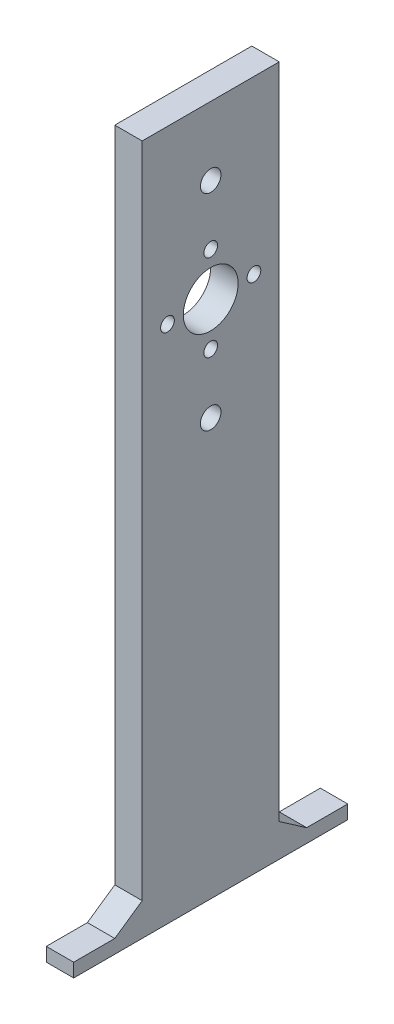
ISO-10303-21;
HEADER;
FILE_DESCRIPTION(('STEP AP214'),'2;1');
FILE_NAME('part.step','',(''),(''),'','','');
FILE_SCHEMA(('AUTOMOTIVE_DESIGN { 1 0 10303 214 1 1 1 1 }'));
ENDSEC;
DATA;
#1=APPLICATION_CONTEXT('core data for automotive mechanical design processes');
#2=APPLICATION_PROTOCOL_DEFINITION('international standard','automotive_design',2000,#1);
#3=PRODUCT_CONTEXT('',#1,'mechanical');
#4=PRODUCT('Part','Part','',(#3));
#5=PRODUCT_RELATED_PRODUCT_CATEGORY('part','',(#4));
#6=PRODUCT_DEFINITION_FORMATION('','',#4);
#7=PRODUCT_DEFINITION_CONTEXT('part definition',#1,'design');
#8=PRODUCT_DEFINITION('design','',#6,#7);
#9=PRODUCT_DEFINITION_SHAPE('','',#8);
#10=(LENGTH_UNIT() NAMED_UNIT(*) SI_UNIT(.MILLI.,.METRE.));
#11=(NAMED_UNIT(*) PLANE_ANGLE_UNIT() SI_UNIT($,.RADIAN.));
#12=(NAMED_UNIT(*) SI_UNIT($,.STERADIAN.) SOLID_ANGLE_UNIT());
#13=UNCERTAINTY_MEASURE_WITH_UNIT(LENGTH_MEASURE(1.E-05),#10,'distance_accuracy_value','');
#14=(GEOMETRIC_REPRESENTATION_CONTEXT(3) GLOBAL_UNCERTAINTY_ASSIGNED_CONTEXT((#13)) GLOBAL_UNIT_ASSIGNED_CONTEXT((#10,
#11,#12)) REPRESENTATION_CONTEXT('',''));
#15=CARTESIAN_POINT('',(0.,0.,0.));
#16=DIRECTION('',(0.,0.,1.));
#17=DIRECTION('',(1.,0.,0.));
#18=AXIS2_PLACEMENT_3D('',#15,#16,#17);
#19=CARTESIAN_POINT('',(0.,252.,25.));
#20=DIRECTION('',(0.,0.,-1.));
#21=DIRECTION('',(-1.,0.,0.));
#22=AXIS2_PLACEMENT_3D('',#19,#20,#21);
#23=PLANE('',#22);
#24=DIRECTION('',(0.,-1.,0.));
#25=VECTOR('',#24,1.);
#26=CARTESIAN_POINT('',(10.,252.,25.));
#27=LINE('',#26,#25);
#28=CARTESIAN_POINT('',(10.,5.,25.));
#29=VERTEX_POINT('',#28);
#30=CARTESIAN_POINT('',(10.,0.,25.));
#31=VERTEX_POINT('',#30);
#32=EDGE_CURVE('E49',#29,#31,#27,.T.);
#33=ORIENTED_EDGE('',*,*,#32,.F.);
#34=DIRECTION('',(-1.,0.,0.));
#35=VECTOR('',#34,1.);
#36=CARTESIAN_POINT('',(10.,5.,25.));
#37=LINE('',#36,#35);
#38=CARTESIAN_POINT('',(0.,5.,25.));
#39=VERTEX_POINT('',#38);
#40=EDGE_CURVE('E156',#29,#39,#37,.T.);
#41=ORIENTED_EDGE('',*,*,#40,.T.);
#42=DIRECTION('',(0.,-1.,0.));
#43=VECTOR('',#42,1.);
#44=CARTESIAN_POINT('',(0.,252.,25.));
#45=LINE('',#44,#43);
#46=CARTESIAN_POINT('',(0.,0.,25.));
#47=VERTEX_POINT('',#46);
#48=EDGE_CURVE('E11',#39,#47,#45,.T.);
#49=ORIENTED_EDGE('',*,*,#48,.T.);
#50=DIRECTION('',(1.,0.,0.));
#51=VECTOR('',#50,1.);
#52=CARTESIAN_POINT('',(0.,0.,25.));
#53=LINE('',#52,#51);
#54=EDGE_CURVE('E152',#47,#31,#53,.T.);
#55=ORIENTED_EDGE('',*,*,#54,.T.);
#56=EDGE_LOOP('',(#33,#41,#49,#55));
#57=FACE_BOUND('',#56,.T.);
#58=ADVANCED_FACE('F42',(#57),#23,.F.);
#59=CARTESIAN_POINT('',(10.,252.,-75.));
#60=DIRECTION('',(-1.,0.,0.));
#61=DIRECTION('',(0.,0.,1.));
#62=AXIS2_PLACEMENT_3D('',#59,#60,#61);
#63=PLANE('',#62);
#64=CARTESIAN_POINT('',(10.,189.5,-40.7700000000017));
#65=DIRECTION('',(-1.,0.,0.));
#66=DIRECTION('',(0.,0.,1.));
#67=AXIS2_PLACEMENT_3D('',#64,#65,#66);
#68=CIRCLE('',#67,2.5);
#69=CARTESIAN_POINT('',(10.,189.5,-38.2700000000017));
#70=VERTEX_POINT('',#69);
#71=EDGE_CURVE('E226',#70,#70,#68,.T.);
#72=ORIENTED_EDGE('',*,*,#71,.T.);
#73=EDGE_LOOP('',(#72));
#74=FACE_BOUND('',#73,.T.);
#75=CARTESIAN_POINT('',(10.,189.5,-9.23000000000167));
#76=DIRECTION('',(-1.,0.,0.));
#77=DIRECTION('',(0.,0.,-1.));
#78=AXIS2_PLACEMENT_3D('',#75,#76,#77);
#79=CIRCLE('',#78,2.5);
#80=CARTESIAN_POINT('',(10.,189.5,-11.7300000000017));
#81=VERTEX_POINT('',#80);
#82=EDGE_CURVE('E246',#81,#81,#79,.T.);
#83=ORIENTED_EDGE('',*,*,#82,.T.);
#84=EDGE_LOOP('',(#83));
#85=FACE_BOUND('',#84,.T.);
#86=CARTESIAN_POINT('',(10.,205.27,-25.0000000000017));
#87=DIRECTION('',(-1.,0.,0.));
#88=DIRECTION('',(0.,0.,1.));
#89=AXIS2_PLACEMENT_3D('',#86,#87,#88);
#90=CIRCLE('',#89,2.5);
#91=CARTESIAN_POINT('',(10.,205.27,-22.5000000000017));
#92=VERTEX_POINT('',#91);
#93=EDGE_CURVE('E240',#92,#92,#90,.T.);
#94=ORIENTED_EDGE('',*,*,#93,.T.);
#95=EDGE_LOOP('',(#94));
#96=FACE_BOUND('',#95,.T.);
#97=CARTESIAN_POINT('',(10.,173.73,-25.0000000000017));
#98=DIRECTION('',(-1.,0.,0.));
#99=DIRECTION('',(0.,0.,-1.));
#100=AXIS2_PLACEMENT_3D('',#97,#98,#99);
#101=CIRCLE('',#100,2.5);
#102=CARTESIAN_POINT('',(10.,173.73,-27.5000000000017));
#103=VERTEX_POINT('',#102);
#104=EDGE_CURVE('E234',#103,#103,#101,.T.);
#105=ORIENTED_EDGE('',*,*,#104,.T.);
#106=EDGE_LOOP('',(#105));
#107=FACE_BOUND('',#106,.T.);
#108=CARTESIAN_POINT('',(10.,152.,-25.0000000000017));
#109=DIRECTION('',(1.,0.,0.));
#110=DIRECTION('',(0.,0.,1.));
#111=AXIS2_PLACEMENT_3D('',#108,#109,#110);
#112=CIRCLE('',#111,3.75);
#113=CARTESIAN_POINT('',(10.,152.,-21.2500000000017));
#114=VERTEX_POINT('',#113);
#115=EDGE_CURVE('E225',#114,#114,#112,.T.);
#116=ORIENTED_EDGE('',*,*,#115,.F.);
#117=EDGE_LOOP('',(#116));
#118=FACE_BOUND('',#117,.T.);
#119=CARTESIAN_POINT('',(10.,227.,-25.0000000000017));
#120=DIRECTION('',(1.,0.,0.));
#121=DIRECTION('',(0.,0.,-1.));
#122=AXIS2_PLACEMENT_3D('',#119,#120,#121);
#123=CIRCLE('',#122,3.75);
#124=CARTESIAN_POINT('',(10.,227.,-28.7500000000017));
#125=VERTEX_POINT('',#124);
#126=EDGE_CURVE('E219',#125,#125,#123,.T.);
#127=ORIENTED_EDGE('',*,*,#126,.F.);
#128=EDGE_LOOP('',(#127));
#129=FACE_BOUND('',#128,.T.);
#130=CARTESIAN_POINT('',(10.,189.5,-25.0000000000017));
#131=DIRECTION('',(1.,0.,0.));
#132=DIRECTION('',(0.,0.,-1.));
#133=AXIS2_PLACEMENT_3D('',#130,#131,#132);
#134=CIRCLE('',#133,10.);
#135=CARTESIAN_POINT('',(10.,189.5,-35.0000000000017));
#136=VERTEX_POINT('',#135);
#137=EDGE_CURVE('E216',#136,#136,#134,.T.);
#138=ORIENTED_EDGE('',*,*,#137,.F.);
#139=EDGE_LOOP('',(#138));
#140=FACE_BOUND('',#139,.T.);
#141=DIRECTION('',(0.,0.,-1.));
#142=VECTOR('',#141,1.);
#143=CARTESIAN_POINT('',(10.,252.,25.));
#144=LINE('',#143,#142);
#145=CARTESIAN_POINT('',(10.,252.,0.));
#146=VERTEX_POINT('',#145);
#147=CARTESIAN_POINT('',(10.,252.,-50.0000000000034));
#148=VERTEX_POINT('',#147);
#149=EDGE_CURVE('E142',#146,#148,#144,.T.);
#150=ORIENTED_EDGE('',*,*,#149,.F.);
#151=DIRECTION('',(0.,-1.,0.));
#152=VECTOR('',#151,1.);
#153=CARTESIAN_POINT('',(10.,11.9378215415848,3.34454686168328E-12));
#154=LINE('',#153,#152);
#155=CARTESIAN_POINT('',(10.,11.9378215415848,3.34454686168328E-12));
#156=VERTEX_POINT('',#155);
#157=EDGE_CURVE('E135',#146,#156,#154,.T.);
#158=ORIENTED_EDGE('',*,*,#157,.T.);
#159=DIRECTION('',(0.,-0.570028639683379,0.821624823104023));
#160=VECTOR('',#159,1.);
#161=CARTESIAN_POINT('',(10.,5.,9.99999999999999));
#162=LINE('',#161,#160);
#163=CARTESIAN_POINT('',(10.,5.,9.99999999999999));
#164=VERTEX_POINT('',#163);
#165=EDGE_CURVE('E213',#156,#164,#162,.T.);
#166=ORIENTED_EDGE('',*,*,#165,.T.);
#167=DIRECTION('',(0.,0.,1.));
#168=VECTOR('',#167,1.);
#169=CARTESIAN_POINT('',(10.,5.,25.));
#170=LINE('',#169,#168);
#171=EDGE_CURVE('E172',#164,#29,#170,.T.);
#172=ORIENTED_EDGE('',*,*,#171,.T.);
#173=ORIENTED_EDGE('',*,*,#32,.T.);
#174=DIRECTION('',(0.,0.,-1.));
#175=VECTOR('',#174,1.);
#176=CARTESIAN_POINT('',(10.,0.,-75.));
#177=LINE('',#176,#175);
#178=CARTESIAN_POINT('',(10.,0.,-75.));
#179=VERTEX_POINT('',#178);
#180=EDGE_CURVE('E155',#31,#179,#177,.T.);
#181=ORIENTED_EDGE('',*,*,#180,.T.);
#182=DIRECTION('',(0.,-1.,0.));
#183=VECTOR('',#182,1.);
#184=CARTESIAN_POINT('',(10.,252.,-75.));
#185=LINE('',#184,#183);
#186=CARTESIAN_POINT('',(10.,5.,-75.));
#187=VERTEX_POINT('',#186);
#188=EDGE_CURVE('E162',#187,#179,#185,.T.);
#189=ORIENTED_EDGE('',*,*,#188,.F.);
#190=DIRECTION('',(0.,0.,1.));
#191=VECTOR('',#190,1.);
#192=CARTESIAN_POINT('',(10.,5.,-75.));
#193=LINE('',#192,#191);
#194=CARTESIAN_POINT('',(10.,5.,-60.));
#195=VERTEX_POINT('',#194);
#196=EDGE_CURVE('E149',#187,#195,#193,.T.);
#197=ORIENTED_EDGE('',*,*,#196,.T.);
#198=DIRECTION('',(0.,0.570028639683379,0.821624823104023));
#199=VECTOR('',#198,1.);
#200=CARTESIAN_POINT('',(10.,5.,-60.));
#201=LINE('',#200,#199);
#202=CARTESIAN_POINT('',(10.,11.9378215415848,-50.0000000000034));
#203=VERTEX_POINT('',#202);
#204=EDGE_CURVE('E187',#195,#203,#201,.T.);
#205=ORIENTED_EDGE('',*,*,#204,.T.);
#206=DIRECTION('',(0.,1.,0.));
#207=VECTOR('',#206,1.);
#208=CARTESIAN_POINT('',(10.,11.9378215415848,-50.0000000000034));
#209=LINE('',#208,#207);
#210=EDGE_CURVE('E191',#203,#148,#209,.T.);
#211=ORIENTED_EDGE('',*,*,#210,.T.);
#212=EDGE_LOOP('',(#150,#158,#166,#172,#173,#181,#189,#197,#205,#211));
#213=FACE_BOUND('',#212,.T.);
#214=ADVANCED_FACE('F167',(#74,#85,#96,#107,#118,#129,#140,#213),#63,.F.);
#215=CARTESIAN_POINT('',(0.,252.,-75.));
#216=DIRECTION('',(0.,0.,1.));
#217=DIRECTION('',(1.,0.,0.));
#218=AXIS2_PLACEMENT_3D('',#215,#216,#217);
#219=PLANE('',#218);
#220=DIRECTION('',(0.,-1.,0.));
#221=VECTOR('',#220,1.);
#222=CARTESIAN_POINT('',(0.,252.,-75.));
#223=LINE('',#222,#221);
#224=CARTESIAN_POINT('',(0.,5.,-75.));
#225=VERTEX_POINT('',#224);
#226=CARTESIAN_POINT('',(0.,0.,-75.));
#227=VERTEX_POINT('',#226);
#228=EDGE_CURVE('E64',#225,#227,#223,.T.);
#229=ORIENTED_EDGE('',*,*,#228,.F.);
#230=DIRECTION('',(-1.,0.,0.));
#231=VECTOR('',#230,1.);
#232=CARTESIAN_POINT('',(10.,5.,-75.));
#233=LINE('',#232,#231);
#234=EDGE_CURVE('E182',#187,#225,#233,.T.);
#235=ORIENTED_EDGE('',*,*,#234,.F.);
#236=ORIENTED_EDGE('',*,*,#188,.T.);
#237=DIRECTION('',(-1.,0.,0.));
#238=VECTOR('',#237,1.);
#239=CARTESIAN_POINT('',(0.,0.,-75.));
#240=LINE('',#239,#238);
#241=EDGE_CURVE('E146',#179,#227,#240,.T.);
#242=ORIENTED_EDGE('',*,*,#241,.T.);
#243=EDGE_LOOP('',(#229,#235,#236,#242));
#244=FACE_BOUND('',#243,.T.);
#245=ADVANCED_FACE('F180',(#244),#219,.F.);
#246=CARTESIAN_POINT('',(0.,252.,0.));
#247=DIRECTION('',(1.,0.,0.));
#248=DIRECTION('',(0.,0.,-1.));
#249=AXIS2_PLACEMENT_3D('',#246,#247,#248);
#250=PLANE('',#249);
#251=CARTESIAN_POINT('',(0.,189.5,-40.7700000000017));
#252=DIRECTION('',(-1.,0.,0.));
#253=DIRECTION('',(0.,0.,1.));
#254=AXIS2_PLACEMENT_3D('',#251,#252,#253);
#255=CIRCLE('',#254,2.5);
#256=CARTESIAN_POINT('',(0.,189.5,-38.2700000000017));
#257=VERTEX_POINT('',#256);
#258=EDGE_CURVE('E252',#257,#257,#255,.T.);
#259=ORIENTED_EDGE('',*,*,#258,.F.);
#260=EDGE_LOOP('',(#259));
#261=FACE_BOUND('',#260,.T.);
#262=CARTESIAN_POINT('',(0.,189.5,-9.23000000000167));
#263=DIRECTION('',(-1.,0.,0.));
#264=DIRECTION('',(0.,0.,-1.));
#265=AXIS2_PLACEMENT_3D('',#262,#263,#264);
#266=CIRCLE('',#265,2.5);
#267=CARTESIAN_POINT('',(0.,189.5,-11.7300000000017));
#268=VERTEX_POINT('',#267);
#269=EDGE_CURVE('E249',#268,#268,#266,.T.);
#270=ORIENTED_EDGE('',*,*,#269,.F.);
#271=EDGE_LOOP('',(#270));
#272=FACE_BOUND('',#271,.T.);
#273=CARTESIAN_POINT('',(0.,205.27,-25.0000000000017));
#274=DIRECTION('',(-1.,0.,0.));
#275=DIRECTION('',(0.,0.,1.));
#276=AXIS2_PLACEMENT_3D('',#273,#274,#275);
#277=CIRCLE('',#276,2.5);
#278=CARTESIAN_POINT('',(0.,205.27,-22.5000000000017));
#279=VERTEX_POINT('',#278);
#280=EDGE_CURVE('E243',#279,#279,#277,.T.);
#281=ORIENTED_EDGE('',*,*,#280,.F.);
#282=EDGE_LOOP('',(#281));
#283=FACE_BOUND('',#282,.T.);
#284=CARTESIAN_POINT('',(0.,173.73,-25.0000000000017));
#285=DIRECTION('',(-1.,0.,0.));
#286=DIRECTION('',(0.,0.,-1.));
#287=AXIS2_PLACEMENT_3D('',#284,#285,#286);
#288=CIRCLE('',#287,2.5);
#289=CARTESIAN_POINT('',(0.,173.73,-27.5000000000017));
#290=VERTEX_POINT('',#289);
#291=EDGE_CURVE('E237',#290,#290,#288,.T.);
#292=ORIENTED_EDGE('',*,*,#291,.F.);
#293=EDGE_LOOP('',(#292));
#294=FACE_BOUND('',#293,.T.);
#295=CARTESIAN_POINT('',(0.,152.,-25.0000000000017));
#296=DIRECTION('',(1.,0.,0.));
#297=DIRECTION('',(0.,0.,1.));
#298=AXIS2_PLACEMENT_3D('',#295,#296,#297);
#299=CIRCLE('',#298,3.75);
#300=CARTESIAN_POINT('',(0.,152.,-21.2500000000017));
#301=VERTEX_POINT('',#300);
#302=EDGE_CURVE('E222',#301,#301,#299,.T.);
#303=ORIENTED_EDGE('',*,*,#302,.T.);
#304=EDGE_LOOP('',(#303));
#305=FACE_BOUND('',#304,.T.);
#306=CARTESIAN_POINT('',(0.,227.,-25.0000000000017));
#307=DIRECTION('',(1.,0.,0.));
#308=DIRECTION('',(0.,0.,-1.));
#309=AXIS2_PLACEMENT_3D('',#306,#307,#308);
#310=CIRCLE('',#309,3.75);
#311=CARTESIAN_POINT('',(0.,227.,-28.7500000000017));
#312=VERTEX_POINT('',#311);
#313=EDGE_CURVE('E229',#312,#312,#310,.T.);
#314=ORIENTED_EDGE('',*,*,#313,.T.);
#315=EDGE_LOOP('',(#314));
#316=FACE_BOUND('',#315,.T.);
#317=CARTESIAN_POINT('',(0.,189.5,-25.0000000000017));
#318=DIRECTION('',(1.,0.,0.));
#319=DIRECTION('',(0.,0.,-1.));
#320=AXIS2_PLACEMENT_3D('',#317,#318,#319);
#321=CIRCLE('',#320,10.);
#322=CARTESIAN_POINT('',(0.,189.5,-35.0000000000017));
#323=VERTEX_POINT('',#322);
#324=EDGE_CURVE('E139',#323,#323,#321,.T.);
#325=ORIENTED_EDGE('',*,*,#324,.T.);
#326=EDGE_LOOP('',(#325));
#327=FACE_BOUND('',#326,.T.);
#328=DIRECTION('',(0.,-1.,0.));
#329=VECTOR('',#328,1.);
#330=CARTESIAN_POINT('',(0.,11.9378215415848,3.34454686168328E-12));
#331=LINE('',#330,#329);
#332=CARTESIAN_POINT('',(0.,252.,0.));
#333=VERTEX_POINT('',#332);
#334=CARTESIAN_POINT('',(0.,11.9378215415848,3.34454686168328E-12));
#335=VERTEX_POINT('',#334);
#336=EDGE_CURVE('E120',#333,#335,#331,.T.);
#337=ORIENTED_EDGE('',*,*,#336,.F.);
#338=DIRECTION('',(0.,0.,1.));
#339=VECTOR('',#338,1.);
#340=CARTESIAN_POINT('',(0.,252.,0.));
#341=LINE('',#340,#339);
#342=CARTESIAN_POINT('',(0.,252.,-50.0000000000034));
#343=VERTEX_POINT('',#342);
#344=EDGE_CURVE('E124',#343,#333,#341,.T.);
#345=ORIENTED_EDGE('',*,*,#344,.F.);
#346=DIRECTION('',(0.,1.,0.));
#347=VECTOR('',#346,1.);
#348=CARTESIAN_POINT('',(0.,11.9378215415848,-50.0000000000034));
#349=LINE('',#348,#347);
#350=CARTESIAN_POINT('',(0.,11.9378215415848,-50.0000000000034));
#351=VERTEX_POINT('',#350);
#352=EDGE_CURVE('E56',#351,#343,#349,.T.);
#353=ORIENTED_EDGE('',*,*,#352,.F.);
#354=DIRECTION('',(0.,0.570028639683379,0.821624823104023));
#355=VECTOR('',#354,1.);
#356=CARTESIAN_POINT('',(0.,5.,-60.));
#357=LINE('',#356,#355);
#358=CARTESIAN_POINT('',(0.,5.,-60.));
#359=VERTEX_POINT('',#358);
#360=EDGE_CURVE('E189',#359,#351,#357,.T.);
#361=ORIENTED_EDGE('',*,*,#360,.F.);
#362=DIRECTION('',(0.,0.,1.));
#363=VECTOR('',#362,1.);
#364=CARTESIAN_POINT('',(0.,5.,-75.));
#365=LINE('',#364,#363);
#366=EDGE_CURVE('E129',#225,#359,#365,.T.);
#367=ORIENTED_EDGE('',*,*,#366,.F.);
#368=ORIENTED_EDGE('',*,*,#228,.T.);
#369=DIRECTION('',(0.,0.,1.));
#370=VECTOR('',#369,1.);
#371=CARTESIAN_POINT('',(0.,0.,0.));
#372=LINE('',#371,#370);
#373=EDGE_CURVE('E143',#227,#47,#372,.T.);
#374=ORIENTED_EDGE('',*,*,#373,.T.);
#375=ORIENTED_EDGE('',*,*,#48,.F.);
#376=DIRECTION('',(0.,0.,1.));
#377=VECTOR('',#376,1.);
#378=CARTESIAN_POINT('',(0.,5.,25.));
#379=LINE('',#378,#377);
#380=CARTESIAN_POINT('',(0.,5.,9.99999999999999));
#381=VERTEX_POINT('',#380);
#382=EDGE_CURVE('E209',#381,#39,#379,.T.);
#383=ORIENTED_EDGE('',*,*,#382,.F.);
#384=DIRECTION('',(0.,-0.570028639683379,0.821624823104023));
#385=VECTOR('',#384,1.);
#386=CARTESIAN_POINT('',(0.,5.,9.99999999999999));
#387=LINE('',#386,#385);
#388=EDGE_CURVE('E127',#335,#381,#387,.T.);
#389=ORIENTED_EDGE('',*,*,#388,.F.);
#390=EDGE_LOOP('',(#337,#345,#353,#361,#367,#368,#374,#375,#383,#389));
#391=FACE_BOUND('',#390,.T.);
#392=ADVANCED_FACE('F122',(#261,#272,#283,#294,#305,#316,#327,#391),#250,.F.);
#393=CARTESIAN_POINT('',(0.,252.,0.));
#394=DIRECTION('',(0.,1.,0.));
#395=DIRECTION('',(0.,0.,1.));
#396=AXIS2_PLACEMENT_3D('',#393,#394,#395);
#397=PLANE('',#396);
#398=DIRECTION('',(1.,0.,0.));
#399=VECTOR('',#398,1.);
#400=CARTESIAN_POINT('',(0.,252.,0.));
#401=LINE('',#400,#399);
#402=EDGE_CURVE('E132',#333,#146,#401,.T.);
#403=ORIENTED_EDGE('',*,*,#402,.T.);
#404=ORIENTED_EDGE('',*,*,#149,.T.);
#405=DIRECTION('',(-1.,0.,0.));
#406=VECTOR('',#405,1.);
#407=CARTESIAN_POINT('',(10.,252.,-50.0000000000034));
#408=LINE('',#407,#406);
#409=EDGE_CURVE('E138',#148,#343,#408,.T.);
#410=ORIENTED_EDGE('',*,*,#409,.T.);
#411=ORIENTED_EDGE('',*,*,#344,.T.);
#412=EDGE_LOOP('',(#403,#404,#410,#411));
#413=FACE_BOUND('',#412,.T.);
#414=ADVANCED_FACE('F141',(#413),#397,.T.);
#415=CARTESIAN_POINT('',(0.,0.,0.));
#416=DIRECTION('',(0.,1.,0.));
#417=DIRECTION('',(0.,0.,1.));
#418=AXIS2_PLACEMENT_3D('',#415,#416,#417);
#419=PLANE('',#418);
#420=ORIENTED_EDGE('',*,*,#54,.F.);
#421=ORIENTED_EDGE('',*,*,#373,.F.);
#422=ORIENTED_EDGE('',*,*,#241,.F.);
#423=ORIENTED_EDGE('',*,*,#180,.F.);
#424=EDGE_LOOP('',(#420,#421,#422,#423));
#425=FACE_BOUND('',#424,.T.);
#426=ADVANCED_FACE('F177',(#425),#419,.F.);
#427=CARTESIAN_POINT('',(10.,11.9378215415848,-50.0000000000034));
#428=DIRECTION('',(0.,0.,1.));
#429=DIRECTION('',(1.,0.,0.));
#430=AXIS2_PLACEMENT_3D('',#427,#428,#429);
#431=PLANE('',#430);
#432=ORIENTED_EDGE('',*,*,#352,.T.);
#433=ORIENTED_EDGE('',*,*,#409,.F.);
#434=ORIENTED_EDGE('',*,*,#210,.F.);
#435=DIRECTION('',(-1.,0.,0.));
#436=VECTOR('',#435,1.);
#437=CARTESIAN_POINT('',(10.,11.9378215415848,-50.0000000000034));
#438=LINE('',#437,#436);
#439=EDGE_CURVE('E199',#203,#351,#438,.T.);
#440=ORIENTED_EDGE('',*,*,#439,.T.);
#441=EDGE_LOOP('',(#432,#433,#434,#440));
#442=FACE_BOUND('',#441,.T.);
#443=ADVANCED_FACE('F299',(#442),#431,.F.);
#444=CARTESIAN_POINT('',(10.,5.,-60.));
#445=DIRECTION('',(0.,-0.821624823104023,0.570028639683379));
#446=DIRECTION('',(0.,-0.570028639683379,-0.821624823104023));
#447=AXIS2_PLACEMENT_3D('',#444,#445,#446);
#448=PLANE('',#447);
#449=ORIENTED_EDGE('',*,*,#360,.T.);
#450=ORIENTED_EDGE('',*,*,#439,.F.);
#451=ORIENTED_EDGE('',*,*,#204,.F.);
#452=DIRECTION('',(-1.,0.,0.));
#453=VECTOR('',#452,1.);
#454=CARTESIAN_POINT('',(10.,5.,-60.));
#455=LINE('',#454,#453);
#456=EDGE_CURVE('E201',#195,#359,#455,.T.);
#457=ORIENTED_EDGE('',*,*,#456,.T.);
#458=EDGE_LOOP('',(#449,#450,#451,#457));
#459=FACE_BOUND('',#458,.T.);
#460=ADVANCED_FACE('F304',(#459),#448,.F.);
#461=CARTESIAN_POINT('',(10.,5.,-75.));
#462=DIRECTION('',(0.,-1.,0.));
#463=DIRECTION('',(0.,0.,-1.));
#464=AXIS2_PLACEMENT_3D('',#461,#462,#463);
#465=PLANE('',#464);
#466=ORIENTED_EDGE('',*,*,#366,.T.);
#467=ORIENTED_EDGE('',*,*,#456,.F.);
#468=ORIENTED_EDGE('',*,*,#196,.F.);
#469=ORIENTED_EDGE('',*,*,#234,.T.);
#470=EDGE_LOOP('',(#466,#467,#468,#469));
#471=FACE_BOUND('',#470,.T.);
#472=ADVANCED_FACE('F307',(#471),#465,.F.);
#473=CARTESIAN_POINT('',(10.,5.,25.));
#474=DIRECTION('',(0.,-1.,0.));
#475=DIRECTION('',(0.,0.,-1.));
#476=AXIS2_PLACEMENT_3D('',#473,#474,#475);
#477=PLANE('',#476);
#478=ORIENTED_EDGE('',*,*,#382,.T.);
#479=ORIENTED_EDGE('',*,*,#40,.F.);
#480=ORIENTED_EDGE('',*,*,#171,.F.);
#481=DIRECTION('',(-1.,0.,0.));
#482=VECTOR('',#481,1.);
#483=CARTESIAN_POINT('',(10.,5.,9.99999999999999));
#484=LINE('',#483,#482);
#485=EDGE_CURVE('E206',#164,#381,#484,.T.);
#486=ORIENTED_EDGE('',*,*,#485,.T.);
#487=EDGE_LOOP('',(#478,#479,#480,#486));
#488=FACE_BOUND('',#487,.T.);
#489=ADVANCED_FACE('F311',(#488),#477,.F.);
#490=CARTESIAN_POINT('',(10.,5.,9.99999999999999));
#491=DIRECTION('',(0.,-0.821624823104023,-0.570028639683379));
#492=DIRECTION('',(0.,0.570028639683379,-0.821624823104023));
#493=AXIS2_PLACEMENT_3D('',#490,#491,#492);
#494=PLANE('',#493);
#495=ORIENTED_EDGE('',*,*,#388,.T.);
#496=ORIENTED_EDGE('',*,*,#485,.F.);
#497=ORIENTED_EDGE('',*,*,#165,.F.);
#498=DIRECTION('',(-1.,0.,0.));
#499=VECTOR('',#498,1.);
#500=CARTESIAN_POINT('',(10.,11.9378215415848,3.34454686168328E-12));
#501=LINE('',#500,#499);
#502=EDGE_CURVE('E204',#156,#335,#501,.T.);
#503=ORIENTED_EDGE('',*,*,#502,.T.);
#504=EDGE_LOOP('',(#495,#496,#497,#503));
#505=FACE_BOUND('',#504,.T.);
#506=ADVANCED_FACE('F314',(#505),#494,.F.);
#507=CARTESIAN_POINT('',(10.,11.9378215415848,3.34454686168328E-12));
#508=DIRECTION('',(0.,0.,-1.));
#509=DIRECTION('',(-1.,0.,0.));
#510=AXIS2_PLACEMENT_3D('',#507,#508,#509);
#511=PLANE('',#510);
#512=ORIENTED_EDGE('',*,*,#336,.T.);
#513=ORIENTED_EDGE('',*,*,#502,.F.);
#514=ORIENTED_EDGE('',*,*,#157,.F.);
#515=ORIENTED_EDGE('',*,*,#402,.F.);
#516=EDGE_LOOP('',(#512,#513,#514,#515));
#517=FACE_BOUND('',#516,.T.);
#518=ADVANCED_FACE('F133',(#517),#511,.F.);
#519=CARTESIAN_POINT('',(0.,189.5,-25.0000000000017));
#520=DIRECTION('',(1.,0.,0.));
#521=DIRECTION('',(0.,0.,-1.));
#522=AXIS2_PLACEMENT_3D('',#519,#520,#521);
#523=CYLINDRICAL_SURFACE('',#522,10.);
#524=ORIENTED_EDGE('',*,*,#324,.F.);
#525=EDGE_LOOP('',(#524));
#526=FACE_BOUND('',#525,.T.);
#527=ORIENTED_EDGE('',*,*,#137,.T.);
#528=EDGE_LOOP('',(#527));
#529=FACE_BOUND('',#528,.T.);
#530=ADVANCED_FACE('F282',(#526,#529),#523,.F.);
#531=CARTESIAN_POINT('',(0.,227.,-25.0000000000017));
#532=DIRECTION('',(1.,0.,0.));
#533=DIRECTION('',(0.,0.,-1.));
#534=AXIS2_PLACEMENT_3D('',#531,#532,#533);
#535=CYLINDRICAL_SURFACE('',#534,3.75);
#536=ORIENTED_EDGE('',*,*,#313,.F.);
#537=EDGE_LOOP('',(#536));
#538=FACE_BOUND('',#537,.T.);
#539=ORIENTED_EDGE('',*,*,#126,.T.);
#540=EDGE_LOOP('',(#539));
#541=FACE_BOUND('',#540,.T.);
#542=ADVANCED_FACE('F285',(#538,#541),#535,.F.);
#543=CARTESIAN_POINT('',(0.,152.,-25.0000000000017));
#544=DIRECTION('',(1.,0.,0.));
#545=DIRECTION('',(0.,0.,-1.));
#546=AXIS2_PLACEMENT_3D('',#543,#544,#545);
#547=CYLINDRICAL_SURFACE('',#546,3.75);
#548=ORIENTED_EDGE('',*,*,#302,.F.);
#549=EDGE_LOOP('',(#548));
#550=FACE_BOUND('',#549,.T.);
#551=ORIENTED_EDGE('',*,*,#115,.T.);
#552=EDGE_LOOP('',(#551));
#553=FACE_BOUND('',#552,.T.);
#554=ADVANCED_FACE('F321',(#550,#553),#547,.F.);
#555=CARTESIAN_POINT('',(10.,173.73,-25.0000000000017));
#556=DIRECTION('',(-1.,0.,0.));
#557=DIRECTION('',(0.,0.,1.));
#558=AXIS2_PLACEMENT_3D('',#555,#556,#557);
#559=CYLINDRICAL_SURFACE('',#558,2.5);
#560=ORIENTED_EDGE('',*,*,#104,.F.);
#561=EDGE_LOOP('',(#560));
#562=FACE_BOUND('',#561,.T.);
#563=ORIENTED_EDGE('',*,*,#291,.T.);
#564=EDGE_LOOP('',(#563));
#565=FACE_BOUND('',#564,.T.);
#566=ADVANCED_FACE('F324',(#562,#565),#559,.F.);
#567=CARTESIAN_POINT('',(10.,205.27,-25.0000000000017));
#568=DIRECTION('',(-1.,0.,0.));
#569=DIRECTION('',(0.,0.,1.));
#570=AXIS2_PLACEMENT_3D('',#567,#568,#569);
#571=CYLINDRICAL_SURFACE('',#570,2.5);
#572=ORIENTED_EDGE('',*,*,#93,.F.);
#573=EDGE_LOOP('',(#572));
#574=FACE_BOUND('',#573,.T.);
#575=ORIENTED_EDGE('',*,*,#280,.T.);
#576=EDGE_LOOP('',(#575));
#577=FACE_BOUND('',#576,.T.);
#578=ADVANCED_FACE('F331',(#574,#577),#571,.F.);
#579=CARTESIAN_POINT('',(10.,189.5,-9.23000000000167));
#580=DIRECTION('',(-1.,0.,0.));
#581=DIRECTION('',(0.,0.,1.));
#582=AXIS2_PLACEMENT_3D('',#579,#580,#581);
#583=CYLINDRICAL_SURFACE('',#582,2.5);
#584=ORIENTED_EDGE('',*,*,#82,.F.);
#585=EDGE_LOOP('',(#584));
#586=FACE_BOUND('',#585,.T.);
#587=ORIENTED_EDGE('',*,*,#269,.T.);
#588=EDGE_LOOP('',(#587));
#589=FACE_BOUND('',#588,.T.);
#590=ADVANCED_FACE('F263',(#586,#589),#583,.F.);
#591=CARTESIAN_POINT('',(10.,189.5,-40.7700000000017));
#592=DIRECTION('',(-1.,0.,0.));
#593=DIRECTION('',(0.,0.,1.));
#594=AXIS2_PLACEMENT_3D('',#591,#592,#593);
#595=CYLINDRICAL_SURFACE('',#594,2.5);
#596=ORIENTED_EDGE('',*,*,#71,.F.);
#597=EDGE_LOOP('',(#596));
#598=FACE_BOUND('',#597,.T.);
#599=ORIENTED_EDGE('',*,*,#258,.T.);
#600=EDGE_LOOP('',(#599));
#601=FACE_BOUND('',#600,.T.);
#602=ADVANCED_FACE('F260',(#598,#601),#595,.F.);
#603=CLOSED_SHELL('',(#58,#214,#245,#392,#414,#426,#443,#460,#472,#489,#506,#518,#530,#542,#554,
#566,#578,#590,#602));
#604=MANIFOLD_SOLID_BREP('B2',#603);
#605=ADVANCED_BREP_SHAPE_REPRESENTATION('',(#18,#604),#14);
#606=SHAPE_DEFINITION_REPRESENTATION(#9,#605);
ENDSEC;
END-ISO-10303-21;
